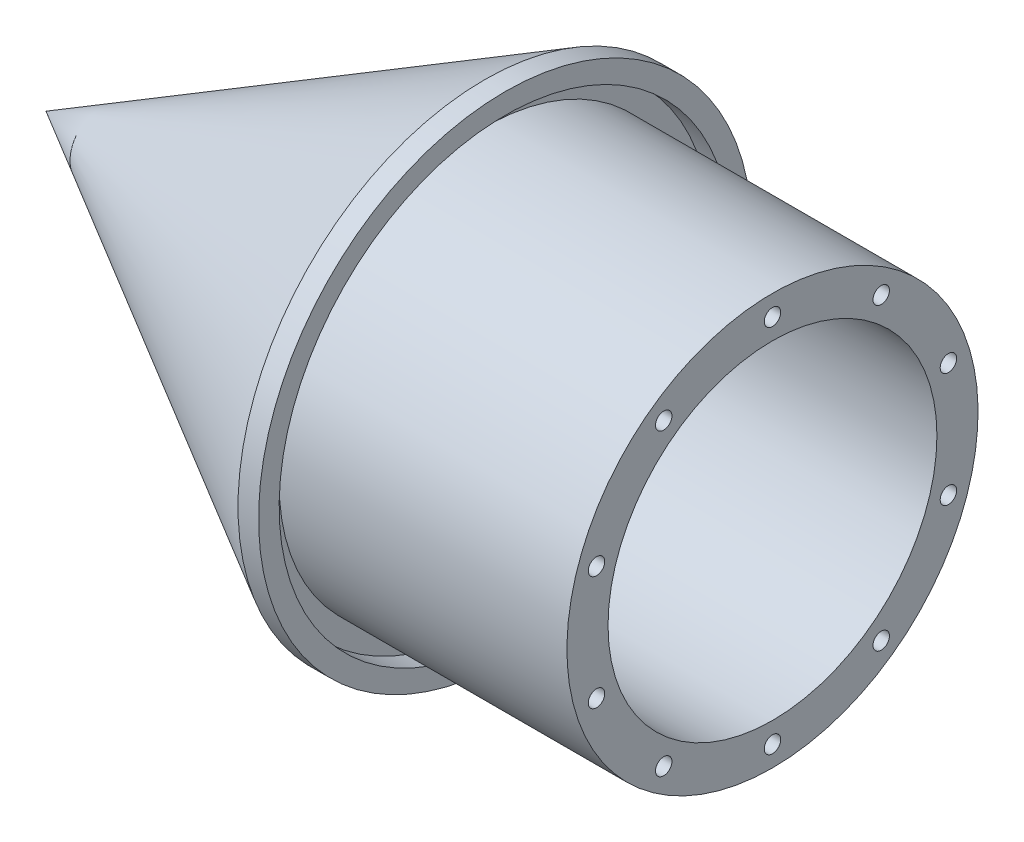
ISO-10303-21;
HEADER;
FILE_DESCRIPTION(('STEP AP214'),'2;1');
FILE_NAME('part.step','',(''),(''),'','','');
FILE_SCHEMA(('AUTOMOTIVE_DESIGN { 1 0 10303 214 1 1 1 1 }'));
ENDSEC;
DATA;
#1=APPLICATION_CONTEXT('core data for automotive mechanical design processes');
#2=APPLICATION_PROTOCOL_DEFINITION('international standard','automotive_design',2000,#1);
#3=PRODUCT_CONTEXT('',#1,'mechanical');
#4=PRODUCT('Part','Part','',(#3));
#5=PRODUCT_RELATED_PRODUCT_CATEGORY('part','',(#4));
#6=PRODUCT_DEFINITION_FORMATION('','',#4);
#7=PRODUCT_DEFINITION_CONTEXT('part definition',#1,'design');
#8=PRODUCT_DEFINITION('design','',#6,#7);
#9=PRODUCT_DEFINITION_SHAPE('','',#8);
#10=(LENGTH_UNIT() NAMED_UNIT(*) SI_UNIT(.MILLI.,.METRE.));
#11=(NAMED_UNIT(*) PLANE_ANGLE_UNIT() SI_UNIT($,.RADIAN.));
#12=(NAMED_UNIT(*) SI_UNIT($,.STERADIAN.) SOLID_ANGLE_UNIT());
#13=UNCERTAINTY_MEASURE_WITH_UNIT(LENGTH_MEASURE(1.E-05),#10,'distance_accuracy_value','');
#14=(GEOMETRIC_REPRESENTATION_CONTEXT(3) GLOBAL_UNCERTAINTY_ASSIGNED_CONTEXT((#13)) GLOBAL_UNIT_ASSIGNED_CONTEXT((#10,
#11,#12)) REPRESENTATION_CONTEXT('',''));
#15=CARTESIAN_POINT('',(0.,0.,0.));
#16=DIRECTION('',(0.,0.,1.));
#17=DIRECTION('',(1.,0.,0.));
#18=AXIS2_PLACEMENT_3D('',#15,#16,#17);
#19=CARTESIAN_POINT('',(-123.889506721427,0.,0.));
#20=DIRECTION('',(-1.,0.,0.));
#21=DIRECTION('',(0.,-1.,0.));
#22=AXIS2_PLACEMENT_3D('',#19,#20,#21);
#23=CYLINDRICAL_SURFACE('',#22,60.);
#24=CARTESIAN_POINT('',(-70.,0.,0.));
#25=DIRECTION('',(-1.,0.,0.));
#26=DIRECTION('',(0.,-1.,0.));
#27=AXIS2_PLACEMENT_3D('',#24,#25,#26);
#28=CIRCLE('',#27,60.);
#29=CARTESIAN_POINT('',(-70.,-60.,0.));
#30=VERTEX_POINT('',#29);
#31=EDGE_CURVE('E11',#30,#30,#28,.T.);
#32=ORIENTED_EDGE('',*,*,#31,.F.);
#33=EDGE_LOOP('',(#32));
#34=FACE_BOUND('',#33,.T.);
#35=CARTESIAN_POINT('',(-65.,0.,0.));
#36=DIRECTION('',(-1.,0.,0.));
#37=DIRECTION('',(0.,-1.,0.));
#38=AXIS2_PLACEMENT_3D('',#35,#36,#37);
#39=CIRCLE('',#38,60.);
#40=CARTESIAN_POINT('',(-65.,-60.,0.));
#41=VERTEX_POINT('',#40);
#42=EDGE_CURVE('E66',#41,#41,#39,.T.);
#43=ORIENTED_EDGE('',*,*,#42,.T.);
#44=EDGE_LOOP('',(#43));
#45=FACE_BOUND('',#44,.T.);
#46=ADVANCED_FACE('F43',(#34,#45),#23,.T.);
#47=CARTESIAN_POINT('',(-70.,0.,0.));
#48=DIRECTION('',(1.,0.,0.));
#49=DIRECTION('',(0.,1.,0.));
#50=AXIS2_PLACEMENT_3D('',#47,#48,#49);
#51=CONICAL_SURFACE('',#50,60.,0.512254135460329);
#52=CARTESIAN_POINT('',(-176.700455888087,0.,0.));
#53=VERTEX_POINT('',#52);
#54=VERTEX_LOOP('',#53);
#55=FACE_BOUND('',#54,.T.);
#56=ORIENTED_EDGE('',*,*,#31,.T.);
#57=EDGE_LOOP('',(#56));
#58=FACE_BOUND('',#57,.T.);
#59=ADVANCED_FACE('F56',(#55,#58),#51,.T.);
#60=CARTESIAN_POINT('',(-160.,0.,0.));
#61=DIRECTION('',(1.,0.,0.));
#62=DIRECTION('',(0.,1.,0.));
#63=AXIS2_PLACEMENT_3D('',#60,#61,#62);
#64=CONICAL_SURFACE('',#63,0.,0.512389460310737);
#65=CARTESIAN_POINT('',(-80.,0.,0.));
#66=DIRECTION('',(-1.,0.,0.));
#67=DIRECTION('',(0.,-1.,0.));
#68=AXIS2_PLACEMENT_3D('',#65,#66,#67);
#69=CIRCLE('',#68,45.);
#70=CARTESIAN_POINT('',(-80.,-45.,0.));
#71=VERTEX_POINT('',#70);
#72=EDGE_CURVE('E50',#71,#71,#69,.T.);
#73=ORIENTED_EDGE('',*,*,#72,.F.);
#74=EDGE_LOOP('',(#73));
#75=FACE_BOUND('',#74,.T.);
#76=CARTESIAN_POINT('',(-160.,0.,0.));
#77=VERTEX_POINT('',#76);
#78=VERTEX_LOOP('',#77);
#79=FACE_BOUND('',#78,.T.);
#80=ADVANCED_FACE('F59',(#75,#79),#64,.F.);
#81=CARTESIAN_POINT('',(-80.,0.,0.));
#82=DIRECTION('',(-1.,0.,0.));
#83=DIRECTION('',(0.,-1.,0.));
#84=AXIS2_PLACEMENT_3D('',#81,#82,#83);
#85=PLANE('',#84);
#86=ORIENTED_EDGE('',*,*,#72,.T.);
#87=EDGE_LOOP('',(#86));
#88=FACE_BOUND('',#87,.T.);
#89=CARTESIAN_POINT('',(-80.,0.,0.));
#90=DIRECTION('',(-1.,0.,0.));
#91=DIRECTION('',(0.,-1.,0.));
#92=AXIS2_PLACEMENT_3D('',#89,#90,#91);
#93=CIRCLE('',#92,40.);
#94=CARTESIAN_POINT('',(-80.,-40.,0.));
#95=VERTEX_POINT('',#94);
#96=EDGE_CURVE('E90',#95,#95,#93,.T.);
#97=ORIENTED_EDGE('',*,*,#96,.F.);
#98=EDGE_LOOP('',(#97));
#99=FACE_BOUND('',#98,.T.);
#100=ADVANCED_FACE('F95',(#88,#99),#85,.T.);
#101=CARTESIAN_POINT('',(-123.889506721427,0.,0.));
#102=DIRECTION('',(-1.,0.,0.));
#103=DIRECTION('',(0.,-1.,0.));
#104=AXIS2_PLACEMENT_3D('',#101,#102,#103);
#105=CYLINDRICAL_SURFACE('',#104,40.);
#106=ORIENTED_EDGE('',*,*,#96,.T.);
#107=EDGE_LOOP('',(#106));
#108=FACE_BOUND('',#107,.T.);
#109=CARTESIAN_POINT('',(0.,0.,0.));
#110=DIRECTION('',(-1.,0.,0.));
#111=DIRECTION('',(0.,-1.,0.));
#112=AXIS2_PLACEMENT_3D('',#109,#110,#111);
#113=CIRCLE('',#112,40.);
#114=CARTESIAN_POINT('',(0.,-40.,0.));
#115=VERTEX_POINT('',#114);
#116=EDGE_CURVE('E87',#115,#115,#113,.T.);
#117=ORIENTED_EDGE('',*,*,#116,.F.);
#118=EDGE_LOOP('',(#117));
#119=FACE_BOUND('',#118,.T.);
#120=ADVANCED_FACE('F103',(#108,#119),#105,.F.);
#121=CARTESIAN_POINT('',(0.,0.,0.));
#122=DIRECTION('',(-1.,0.,0.));
#123=DIRECTION('',(0.,-1.,0.));
#124=AXIS2_PLACEMENT_3D('',#121,#122,#123);
#125=PLANE('',#124);
#126=CARTESIAN_POINT('',(0.,36.405764746873,26.4503363531608));
#127=DIRECTION('',(1.,0.,0.));
#128=DIRECTION('',(0.,0.809016994374955,0.587785252292462));
#129=AXIS2_PLACEMENT_3D('',#126,#127,#128);
#130=CIRCLE('',#129,2.);
#131=CARTESIAN_POINT('',(0.,38.0237987356229,27.6259068577457));
#132=VERTEX_POINT('',#131);
#133=EDGE_CURVE('E260',#132,#132,#130,.T.);
#134=ORIENTED_EDGE('',*,*,#133,.F.);
#135=EDGE_LOOP('',(#134));
#136=FACE_BOUND('',#135,.T.);
#137=CARTESIAN_POINT('',(0.,13.9057647468731,42.7975432332817));
#138=DIRECTION('',(1.,0.,0.));
#139=DIRECTION('',(0.,0.309016994374958,0.95105651629515));
#140=AXIS2_PLACEMENT_3D('',#137,#138,#139);
#141=CIRCLE('',#140,2.);
#142=CARTESIAN_POINT('',(0.,14.523798735623,44.699656265872));
#143=VERTEX_POINT('',#142);
#144=EDGE_CURVE('E254',#143,#143,#141,.T.);
#145=ORIENTED_EDGE('',*,*,#144,.F.);
#146=EDGE_LOOP('',(#145));
#147=FACE_BOUND('',#146,.T.);
#148=CARTESIAN_POINT('',(0.,-13.9057647468722,42.797543233282));
#149=DIRECTION('',(1.,0.,0.));
#150=DIRECTION('',(0.,-0.309016994374938,0.951056516295157));
#151=AXIS2_PLACEMENT_3D('',#148,#149,#150);
#152=CIRCLE('',#151,2.);
#153=CARTESIAN_POINT('',(0.,-14.5237987356221,44.6996562658723));
#154=VERTEX_POINT('',#153);
#155=EDGE_CURVE('E248',#154,#154,#152,.T.);
#156=ORIENTED_EDGE('',*,*,#155,.F.);
#157=EDGE_LOOP('',(#156));
#158=FACE_BOUND('',#157,.T.);
#159=CARTESIAN_POINT('',(0.,-36.4057647468724,26.4503363531616));
#160=DIRECTION('',(1.,0.,0.));
#161=DIRECTION('',(0.,-0.809016994374942,0.58778525229248));
#162=AXIS2_PLACEMENT_3D('',#159,#160,#161);
#163=CIRCLE('',#162,2.);
#164=CARTESIAN_POINT('',(0.,-38.0237987356223,27.6259068577466));
#165=VERTEX_POINT('',#164);
#166=EDGE_CURVE('E242',#165,#165,#163,.T.);
#167=ORIENTED_EDGE('',*,*,#166,.F.);
#168=EDGE_LOOP('',(#167));
#169=FACE_BOUND('',#168,.T.);
#170=CARTESIAN_POINT('',(0.,-45.,0.));
#171=DIRECTION('',(1.,0.,0.));
#172=DIRECTION('',(0.,-1.,0.));
#173=AXIS2_PLACEMENT_3D('',#170,#171,#172);
#174=CIRCLE('',#173,2.);
#175=CARTESIAN_POINT('',(0.,-47.,0.));
#176=VERTEX_POINT('',#175);
#177=EDGE_CURVE('E236',#176,#176,#174,.T.);
#178=ORIENTED_EDGE('',*,*,#177,.F.);
#179=EDGE_LOOP('',(#178));
#180=FACE_BOUND('',#179,.T.);
#181=CARTESIAN_POINT('',(0.,-36.4057647468728,-26.4503363531611));
#182=DIRECTION('',(1.,0.,0.));
#183=DIRECTION('',(0.,-0.809016994374951,-0.587785252292469));
#184=AXIS2_PLACEMENT_3D('',#181,#182,#183);
#185=CIRCLE('',#184,2.);
#186=CARTESIAN_POINT('',(0.,-38.0237987356227,-27.625906857746));
#187=VERTEX_POINT('',#186);
#188=EDGE_CURVE('E230',#187,#187,#185,.T.);
#189=ORIENTED_EDGE('',*,*,#188,.F.);
#190=EDGE_LOOP('',(#189));
#191=FACE_BOUND('',#190,.T.);
#192=CARTESIAN_POINT('',(0.,-13.9057647468728,-42.7975432332818));
#193=DIRECTION('',(1.,0.,0.));
#194=DIRECTION('',(0.,-0.309016994374952,-0.951056516295152));
#195=AXIS2_PLACEMENT_3D('',#192,#193,#194);
#196=CIRCLE('',#195,2.);
#197=CARTESIAN_POINT('',(0.,-14.5237987356227,-44.6996562658721));
#198=VERTEX_POINT('',#197);
#199=EDGE_CURVE('E224',#198,#198,#196,.T.);
#200=ORIENTED_EDGE('',*,*,#199,.F.);
#201=EDGE_LOOP('',(#200));
#202=FACE_BOUND('',#201,.T.);
#203=CARTESIAN_POINT('',(0.,13.9057647468725,-42.7975432332819));
#204=DIRECTION('',(1.,0.,0.));
#205=DIRECTION('',(0.,0.309016994374945,-0.951056516295155));
#206=AXIS2_PLACEMENT_3D('',#203,#204,#205);
#207=CIRCLE('',#206,2.);
#208=CARTESIAN_POINT('',(0.,14.5237987356224,-44.6996562658722));
#209=VERTEX_POINT('',#208);
#210=EDGE_CURVE('E213',#209,#209,#207,.T.);
#211=ORIENTED_EDGE('',*,*,#210,.F.);
#212=EDGE_LOOP('',(#211));
#213=FACE_BOUND('',#212,.T.);
#214=CARTESIAN_POINT('',(0.,36.4057647468726,-26.4503363531613));
#215=DIRECTION('',(1.,0.,0.));
#216=DIRECTION('',(0.,0.809016994374947,-0.587785252292474));
#217=AXIS2_PLACEMENT_3D('',#214,#215,#216);
#218=CIRCLE('',#217,2.);
#219=CARTESIAN_POINT('',(0.,38.0237987356225,-27.6259068577463));
#220=VERTEX_POINT('',#219);
#221=EDGE_CURVE('E212',#220,#220,#218,.T.);
#222=ORIENTED_EDGE('',*,*,#221,.F.);
#223=EDGE_LOOP('',(#222));
#224=FACE_BOUND('',#223,.T.);
#225=CARTESIAN_POINT('',(0.,45.,0.));
#226=DIRECTION('',(1.,0.,0.));
#227=DIRECTION('',(0.,1.,0.));
#228=AXIS2_PLACEMENT_3D('',#225,#226,#227);
#229=CIRCLE('',#228,2.);
#230=CARTESIAN_POINT('',(0.,47.,0.));
#231=VERTEX_POINT('',#230);
#232=EDGE_CURVE('E75',#231,#231,#229,.T.);
#233=ORIENTED_EDGE('',*,*,#232,.F.);
#234=EDGE_LOOP('',(#233));
#235=FACE_BOUND('',#234,.T.);
#236=CARTESIAN_POINT('',(0.,0.,0.));
#237=DIRECTION('',(-1.,0.,0.));
#238=DIRECTION('',(0.,-1.,0.));
#239=AXIS2_PLACEMENT_3D('',#236,#237,#238);
#240=CIRCLE('',#239,50.);
#241=CARTESIAN_POINT('',(0.,-50.,0.));
#242=VERTEX_POINT('',#241);
#243=EDGE_CURVE('E84',#242,#242,#240,.T.);
#244=ORIENTED_EDGE('',*,*,#243,.F.);
#245=EDGE_LOOP('',(#244));
#246=FACE_BOUND('',#245,.T.);
#247=ORIENTED_EDGE('',*,*,#116,.T.);
#248=EDGE_LOOP('',(#247));
#249=FACE_BOUND('',#248,.T.);
#250=ADVANCED_FACE('F108',(#136,#147,#158,#169,#180,#191,#202,#213,#224,#235,#246,#249),#125,.F.);
#251=CARTESIAN_POINT('',(-123.889506721427,0.,0.));
#252=DIRECTION('',(-1.,0.,0.));
#253=DIRECTION('',(0.,-1.,0.));
#254=AXIS2_PLACEMENT_3D('',#251,#252,#253);
#255=CYLINDRICAL_SURFACE('',#254,50.);
#256=CARTESIAN_POINT('',(-70.,0.,0.));
#257=DIRECTION('',(-1.,0.,0.));
#258=DIRECTION('',(0.,-1.,0.));
#259=AXIS2_PLACEMENT_3D('',#256,#257,#258);
#260=CIRCLE('',#259,50.);
#261=CARTESIAN_POINT('',(-70.,-50.,0.));
#262=VERTEX_POINT('',#261);
#263=EDGE_CURVE('E81',#262,#262,#260,.T.);
#264=ORIENTED_EDGE('',*,*,#263,.F.);
#265=EDGE_LOOP('',(#264));
#266=FACE_BOUND('',#265,.T.);
#267=ORIENTED_EDGE('',*,*,#243,.T.);
#268=EDGE_LOOP('',(#267));
#269=FACE_BOUND('',#268,.T.);
#270=ADVANCED_FACE('F112',(#266,#269),#255,.T.);
#271=CARTESIAN_POINT('',(-70.,0.,0.));
#272=DIRECTION('',(-1.,0.,0.));
#273=DIRECTION('',(0.,-1.,0.));
#274=AXIS2_PLACEMENT_3D('',#271,#272,#273);
#275=PLANE('',#274);
#276=CARTESIAN_POINT('',(-70.,0.,0.));
#277=DIRECTION('',(-1.,0.,0.));
#278=DIRECTION('',(0.,-1.,0.));
#279=AXIS2_PLACEMENT_3D('',#276,#277,#278);
#280=CIRCLE('',#279,55.);
#281=CARTESIAN_POINT('',(-70.,-55.,0.));
#282=VERTEX_POINT('',#281);
#283=EDGE_CURVE('E72',#282,#282,#280,.T.);
#284=ORIENTED_EDGE('',*,*,#283,.F.);
#285=EDGE_LOOP('',(#284));
#286=FACE_BOUND('',#285,.T.);
#287=ORIENTED_EDGE('',*,*,#263,.T.);
#288=EDGE_LOOP('',(#287));
#289=FACE_BOUND('',#288,.T.);
#290=ADVANCED_FACE('F116',(#286,#289),#275,.F.);
#291=CARTESIAN_POINT('',(-123.889506721427,0.,0.));
#292=DIRECTION('',(-1.,0.,0.));
#293=DIRECTION('',(0.,-1.,0.));
#294=AXIS2_PLACEMENT_3D('',#291,#292,#293);
#295=CYLINDRICAL_SURFACE('',#294,55.);
#296=CARTESIAN_POINT('',(-65.,0.,0.));
#297=DIRECTION('',(-1.,0.,0.));
#298=DIRECTION('',(0.,-1.,0.));
#299=AXIS2_PLACEMENT_3D('',#296,#297,#298);
#300=CIRCLE('',#299,55.);
#301=CARTESIAN_POINT('',(-65.,-55.,0.));
#302=VERTEX_POINT('',#301);
#303=EDGE_CURVE('E68',#302,#302,#300,.T.);
#304=ORIENTED_EDGE('',*,*,#303,.F.);
#305=EDGE_LOOP('',(#304));
#306=FACE_BOUND('',#305,.T.);
#307=ORIENTED_EDGE('',*,*,#283,.T.);
#308=EDGE_LOOP('',(#307));
#309=FACE_BOUND('',#308,.T.);
#310=ADVANCED_FACE('F120',(#306,#309),#295,.F.);
#311=CARTESIAN_POINT('',(-65.,0.,0.));
#312=DIRECTION('',(-1.,0.,0.));
#313=DIRECTION('',(0.,-1.,0.));
#314=AXIS2_PLACEMENT_3D('',#311,#312,#313);
#315=PLANE('',#314);
#316=ORIENTED_EDGE('',*,*,#42,.F.);
#317=EDGE_LOOP('',(#316));
#318=FACE_BOUND('',#317,.T.);
#319=ORIENTED_EDGE('',*,*,#303,.T.);
#320=EDGE_LOOP('',(#319));
#321=FACE_BOUND('',#320,.T.);
#322=ADVANCED_FACE('F124',(#318,#321),#315,.F.);
#323=CARTESIAN_POINT('',(-20.,45.,0.));
#324=DIRECTION('',(1.,0.,0.));
#325=DIRECTION('',(0.,1.,0.));
#326=AXIS2_PLACEMENT_3D('',#323,#324,#325);
#327=CYLINDRICAL_SURFACE('',#326,2.);
#328=CARTESIAN_POINT('',(-20.,45.,0.));
#329=DIRECTION('',(1.,0.,0.));
#330=DIRECTION('',(0.,1.,0.));
#331=AXIS2_PLACEMENT_3D('',#328,#329,#330);
#332=CIRCLE('',#331,2.);
#333=CARTESIAN_POINT('',(-20.,47.,0.));
#334=VERTEX_POINT('',#333);
#335=EDGE_CURVE('E69',#334,#334,#332,.T.);
#336=ORIENTED_EDGE('',*,*,#335,.F.);
#337=EDGE_LOOP('',(#336));
#338=FACE_BOUND('',#337,.T.);
#339=ORIENTED_EDGE('',*,*,#232,.T.);
#340=EDGE_LOOP('',(#339));
#341=FACE_BOUND('',#340,.T.);
#342=ADVANCED_FACE('F128',(#338,#341),#327,.F.);
#343=CARTESIAN_POINT('',(-20.,45.,0.));
#344=DIRECTION('',(1.,0.,0.));
#345=DIRECTION('',(0.,1.,0.));
#346=AXIS2_PLACEMENT_3D('',#343,#344,#345);
#347=PLANE('',#346);
#348=ORIENTED_EDGE('',*,*,#335,.T.);
#349=EDGE_LOOP('',(#348));
#350=FACE_BOUND('',#349,.T.);
#351=ADVANCED_FACE('F131',(#350),#347,.T.);
#352=CARTESIAN_POINT('',(-20.,36.4057647468726,-26.4503363531613));
#353=DIRECTION('',(1.,0.,0.));
#354=DIRECTION('',(0.,1.,0.));
#355=AXIS2_PLACEMENT_3D('',#352,#353,#354);
#356=CYLINDRICAL_SURFACE('',#355,2.);
#357=CARTESIAN_POINT('',(-20.,36.4057647468726,-26.4503363531613));
#358=DIRECTION('',(1.,0.,0.));
#359=DIRECTION('',(0.,0.809016994374947,-0.587785252292474));
#360=AXIS2_PLACEMENT_3D('',#357,#358,#359);
#361=CIRCLE('',#360,2.);
#362=CARTESIAN_POINT('',(-20.,38.0237987356225,-27.6259068577463));
#363=VERTEX_POINT('',#362);
#364=EDGE_CURVE('E216',#363,#363,#361,.T.);
#365=ORIENTED_EDGE('',*,*,#364,.F.);
#366=EDGE_LOOP('',(#365));
#367=FACE_BOUND('',#366,.T.);
#368=ORIENTED_EDGE('',*,*,#221,.T.);
#369=EDGE_LOOP('',(#368));
#370=FACE_BOUND('',#369,.T.);
#371=ADVANCED_FACE('F135',(#367,#370),#356,.F.);
#372=CARTESIAN_POINT('',(-20.,36.4057647468726,-26.4503363531613));
#373=DIRECTION('',(1.,0.,0.));
#374=DIRECTION('',(0.,0.809016994374947,-0.587785252292474));
#375=AXIS2_PLACEMENT_3D('',#372,#373,#374);
#376=PLANE('',#375);
#377=ORIENTED_EDGE('',*,*,#364,.T.);
#378=EDGE_LOOP('',(#377));
#379=FACE_BOUND('',#378,.T.);
#380=ADVANCED_FACE('F139',(#379),#376,.T.);
#381=CARTESIAN_POINT('',(-20.,13.9057647468725,-42.7975432332819));
#382=DIRECTION('',(1.,0.,0.));
#383=DIRECTION('',(0.,1.,0.));
#384=AXIS2_PLACEMENT_3D('',#381,#382,#383);
#385=CYLINDRICAL_SURFACE('',#384,2.);
#386=CARTESIAN_POINT('',(-20.,13.9057647468725,-42.7975432332819));
#387=DIRECTION('',(1.,0.,0.));
#388=DIRECTION('',(0.,0.309016994374945,-0.951056516295155));
#389=AXIS2_PLACEMENT_3D('',#386,#387,#388);
#390=CIRCLE('',#389,2.);
#391=CARTESIAN_POINT('',(-20.,14.5237987356224,-44.6996562658722));
#392=VERTEX_POINT('',#391);
#393=EDGE_CURVE('E211',#392,#392,#390,.T.);
#394=ORIENTED_EDGE('',*,*,#393,.F.);
#395=EDGE_LOOP('',(#394));
#396=FACE_BOUND('',#395,.T.);
#397=ORIENTED_EDGE('',*,*,#210,.T.);
#398=EDGE_LOOP('',(#397));
#399=FACE_BOUND('',#398,.T.);
#400=ADVANCED_FACE('F143',(#396,#399),#385,.F.);
#401=CARTESIAN_POINT('',(-20.,13.9057647468725,-42.7975432332819));
#402=DIRECTION('',(1.,0.,0.));
#403=DIRECTION('',(0.,0.309016994374945,-0.951056516295155));
#404=AXIS2_PLACEMENT_3D('',#401,#402,#403);
#405=PLANE('',#404);
#406=ORIENTED_EDGE('',*,*,#393,.T.);
#407=EDGE_LOOP('',(#406));
#408=FACE_BOUND('',#407,.T.);
#409=ADVANCED_FACE('F197',(#408),#405,.T.);
#410=CARTESIAN_POINT('',(-20.,-13.9057647468728,-42.7975432332818));
#411=DIRECTION('',(1.,0.,0.));
#412=DIRECTION('',(0.,1.,0.));
#413=AXIS2_PLACEMENT_3D('',#410,#411,#412);
#414=CYLINDRICAL_SURFACE('',#413,2.);
#415=CARTESIAN_POINT('',(-20.,-13.9057647468728,-42.7975432332818));
#416=DIRECTION('',(1.,0.,0.));
#417=DIRECTION('',(0.,-0.309016994374952,-0.951056516295152));
#418=AXIS2_PLACEMENT_3D('',#415,#416,#417);
#419=CIRCLE('',#418,2.);
#420=CARTESIAN_POINT('',(-20.,-14.5237987356227,-44.6996562658721));
#421=VERTEX_POINT('',#420);
#422=EDGE_CURVE('E219',#421,#421,#419,.T.);
#423=ORIENTED_EDGE('',*,*,#422,.F.);
#424=EDGE_LOOP('',(#423));
#425=FACE_BOUND('',#424,.T.);
#426=ORIENTED_EDGE('',*,*,#199,.T.);
#427=EDGE_LOOP('',(#426));
#428=FACE_BOUND('',#427,.T.);
#429=ADVANCED_FACE('F194',(#425,#428),#414,.F.);
#430=CARTESIAN_POINT('',(-20.,-13.9057647468728,-42.7975432332818));
#431=DIRECTION('',(1.,0.,0.));
#432=DIRECTION('',(0.,-0.309016994374952,-0.951056516295152));
#433=AXIS2_PLACEMENT_3D('',#430,#431,#432);
#434=PLANE('',#433);
#435=ORIENTED_EDGE('',*,*,#422,.T.);
#436=EDGE_LOOP('',(#435));
#437=FACE_BOUND('',#436,.T.);
#438=ADVANCED_FACE('F189',(#437),#434,.T.);
#439=CARTESIAN_POINT('',(-20.,-36.4057647468728,-26.4503363531611));
#440=DIRECTION('',(1.,0.,0.));
#441=DIRECTION('',(0.,1.,0.));
#442=AXIS2_PLACEMENT_3D('',#439,#440,#441);
#443=CYLINDRICAL_SURFACE('',#442,2.);
#444=CARTESIAN_POINT('',(-20.,-36.4057647468728,-26.4503363531611));
#445=DIRECTION('',(1.,0.,0.));
#446=DIRECTION('',(0.,-0.809016994374951,-0.587785252292469));
#447=AXIS2_PLACEMENT_3D('',#444,#445,#446);
#448=CIRCLE('',#447,2.);
#449=CARTESIAN_POINT('',(-20.,-38.0237987356227,-27.625906857746));
#450=VERTEX_POINT('',#449);
#451=EDGE_CURVE('E227',#450,#450,#448,.T.);
#452=ORIENTED_EDGE('',*,*,#451,.F.);
#453=EDGE_LOOP('',(#452));
#454=FACE_BOUND('',#453,.T.);
#455=ORIENTED_EDGE('',*,*,#188,.T.);
#456=EDGE_LOOP('',(#455));
#457=FACE_BOUND('',#456,.T.);
#458=ADVANCED_FACE('F186',(#454,#457),#443,.F.);
#459=CARTESIAN_POINT('',(-20.,-36.4057647468728,-26.4503363531611));
#460=DIRECTION('',(1.,0.,0.));
#461=DIRECTION('',(0.,-0.809016994374951,-0.587785252292469));
#462=AXIS2_PLACEMENT_3D('',#459,#460,#461);
#463=PLANE('',#462);
#464=ORIENTED_EDGE('',*,*,#451,.T.);
#465=EDGE_LOOP('',(#464));
#466=FACE_BOUND('',#465,.T.);
#467=ADVANCED_FACE('F181',(#466),#463,.T.);
#468=CARTESIAN_POINT('',(-20.,-45.,0.));
#469=DIRECTION('',(1.,0.,0.));
#470=DIRECTION('',(0.,1.,0.));
#471=AXIS2_PLACEMENT_3D('',#468,#469,#470);
#472=CYLINDRICAL_SURFACE('',#471,2.);
#473=CARTESIAN_POINT('',(-20.,-45.,0.));
#474=DIRECTION('',(1.,0.,0.));
#475=DIRECTION('',(0.,-1.,0.));
#476=AXIS2_PLACEMENT_3D('',#473,#474,#475);
#477=CIRCLE('',#476,2.);
#478=CARTESIAN_POINT('',(-20.,-47.,0.));
#479=VERTEX_POINT('',#478);
#480=EDGE_CURVE('E233',#479,#479,#477,.T.);
#481=ORIENTED_EDGE('',*,*,#480,.F.);
#482=EDGE_LOOP('',(#481));
#483=FACE_BOUND('',#482,.T.);
#484=ORIENTED_EDGE('',*,*,#177,.T.);
#485=EDGE_LOOP('',(#484));
#486=FACE_BOUND('',#485,.T.);
#487=ADVANCED_FACE('F178',(#483,#486),#472,.F.);
#488=CARTESIAN_POINT('',(-20.,-45.,0.));
#489=DIRECTION('',(1.,0.,0.));
#490=DIRECTION('',(0.,-1.,0.));
#491=AXIS2_PLACEMENT_3D('',#488,#489,#490);
#492=PLANE('',#491);
#493=ORIENTED_EDGE('',*,*,#480,.T.);
#494=EDGE_LOOP('',(#493));
#495=FACE_BOUND('',#494,.T.);
#496=ADVANCED_FACE('F173',(#495),#492,.T.);
#497=CARTESIAN_POINT('',(-20.,-36.4057647468724,26.4503363531616));
#498=DIRECTION('',(1.,0.,0.));
#499=DIRECTION('',(0.,1.,0.));
#500=AXIS2_PLACEMENT_3D('',#497,#498,#499);
#501=CYLINDRICAL_SURFACE('',#500,2.);
#502=CARTESIAN_POINT('',(-20.,-36.4057647468724,26.4503363531616));
#503=DIRECTION('',(1.,0.,0.));
#504=DIRECTION('',(0.,-0.809016994374942,0.58778525229248));
#505=AXIS2_PLACEMENT_3D('',#502,#503,#504);
#506=CIRCLE('',#505,2.);
#507=CARTESIAN_POINT('',(-20.,-38.0237987356223,27.6259068577466));
#508=VERTEX_POINT('',#507);
#509=EDGE_CURVE('E239',#508,#508,#506,.T.);
#510=ORIENTED_EDGE('',*,*,#509,.F.);
#511=EDGE_LOOP('',(#510));
#512=FACE_BOUND('',#511,.T.);
#513=ORIENTED_EDGE('',*,*,#166,.T.);
#514=EDGE_LOOP('',(#513));
#515=FACE_BOUND('',#514,.T.);
#516=ADVANCED_FACE('F170',(#512,#515),#501,.F.);
#517=CARTESIAN_POINT('',(-20.,-36.4057647468724,26.4503363531616));
#518=DIRECTION('',(1.,0.,0.));
#519=DIRECTION('',(0.,-0.809016994374942,0.58778525229248));
#520=AXIS2_PLACEMENT_3D('',#517,#518,#519);
#521=PLANE('',#520);
#522=ORIENTED_EDGE('',*,*,#509,.T.);
#523=EDGE_LOOP('',(#522));
#524=FACE_BOUND('',#523,.T.);
#525=ADVANCED_FACE('F165',(#524),#521,.T.);
#526=CARTESIAN_POINT('',(-20.,-13.9057647468722,42.797543233282));
#527=DIRECTION('',(1.,0.,0.));
#528=DIRECTION('',(0.,1.,0.));
#529=AXIS2_PLACEMENT_3D('',#526,#527,#528);
#530=CYLINDRICAL_SURFACE('',#529,2.);
#531=CARTESIAN_POINT('',(-20.,-13.9057647468722,42.797543233282));
#532=DIRECTION('',(1.,0.,0.));
#533=DIRECTION('',(0.,-0.309016994374938,0.951056516295157));
#534=AXIS2_PLACEMENT_3D('',#531,#532,#533);
#535=CIRCLE('',#534,2.);
#536=CARTESIAN_POINT('',(-20.,-14.5237987356221,44.6996562658723));
#537=VERTEX_POINT('',#536);
#538=EDGE_CURVE('E245',#537,#537,#535,.T.);
#539=ORIENTED_EDGE('',*,*,#538,.F.);
#540=EDGE_LOOP('',(#539));
#541=FACE_BOUND('',#540,.T.);
#542=ORIENTED_EDGE('',*,*,#155,.T.);
#543=EDGE_LOOP('',(#542));
#544=FACE_BOUND('',#543,.T.);
#545=ADVANCED_FACE('F162',(#541,#544),#530,.F.);
#546=CARTESIAN_POINT('',(-20.,-13.9057647468722,42.797543233282));
#547=DIRECTION('',(1.,0.,0.));
#548=DIRECTION('',(0.,-0.309016994374938,0.951056516295157));
#549=AXIS2_PLACEMENT_3D('',#546,#547,#548);
#550=PLANE('',#549);
#551=ORIENTED_EDGE('',*,*,#538,.T.);
#552=EDGE_LOOP('',(#551));
#553=FACE_BOUND('',#552,.T.);
#554=ADVANCED_FACE('F157',(#553),#550,.T.);
#555=CARTESIAN_POINT('',(-20.,13.9057647468731,42.7975432332817));
#556=DIRECTION('',(1.,0.,0.));
#557=DIRECTION('',(0.,1.,0.));
#558=AXIS2_PLACEMENT_3D('',#555,#556,#557);
#559=CYLINDRICAL_SURFACE('',#558,2.);
#560=CARTESIAN_POINT('',(-20.,13.9057647468731,42.7975432332817));
#561=DIRECTION('',(1.,0.,0.));
#562=DIRECTION('',(0.,0.309016994374958,0.95105651629515));
#563=AXIS2_PLACEMENT_3D('',#560,#561,#562);
#564=CIRCLE('',#563,2.);
#565=CARTESIAN_POINT('',(-20.,14.523798735623,44.699656265872));
#566=VERTEX_POINT('',#565);
#567=EDGE_CURVE('E251',#566,#566,#564,.T.);
#568=ORIENTED_EDGE('',*,*,#567,.F.);
#569=EDGE_LOOP('',(#568));
#570=FACE_BOUND('',#569,.T.);
#571=ORIENTED_EDGE('',*,*,#144,.T.);
#572=EDGE_LOOP('',(#571));
#573=FACE_BOUND('',#572,.T.);
#574=ADVANCED_FACE('F154',(#570,#573),#559,.F.);
#575=CARTESIAN_POINT('',(-20.,13.9057647468731,42.7975432332817));
#576=DIRECTION('',(1.,0.,0.));
#577=DIRECTION('',(0.,0.309016994374958,0.95105651629515));
#578=AXIS2_PLACEMENT_3D('',#575,#576,#577);
#579=PLANE('',#578);
#580=ORIENTED_EDGE('',*,*,#567,.T.);
#581=EDGE_LOOP('',(#580));
#582=FACE_BOUND('',#581,.T.);
#583=ADVANCED_FACE('F149',(#582),#579,.T.);
#584=CARTESIAN_POINT('',(-20.,36.405764746873,26.4503363531608));
#585=DIRECTION('',(1.,0.,0.));
#586=DIRECTION('',(0.,1.,0.));
#587=AXIS2_PLACEMENT_3D('',#584,#585,#586);
#588=CYLINDRICAL_SURFACE('',#587,2.);
#589=CARTESIAN_POINT('',(-20.,36.405764746873,26.4503363531608));
#590=DIRECTION('',(1.,0.,0.));
#591=DIRECTION('',(0.,0.809016994374955,0.587785252292462));
#592=AXIS2_PLACEMENT_3D('',#589,#590,#591);
#593=CIRCLE('',#592,2.);
#594=CARTESIAN_POINT('',(-20.,38.0237987356229,27.6259068577457));
#595=VERTEX_POINT('',#594);
#596=EDGE_CURVE('E257',#595,#595,#593,.T.);
#597=ORIENTED_EDGE('',*,*,#596,.F.);
#598=EDGE_LOOP('',(#597));
#599=FACE_BOUND('',#598,.T.);
#600=ORIENTED_EDGE('',*,*,#133,.T.);
#601=EDGE_LOOP('',(#600));
#602=FACE_BOUND('',#601,.T.);
#603=ADVANCED_FACE('F145',(#599,#602),#588,.F.);
#604=CARTESIAN_POINT('',(-20.,36.405764746873,26.4503363531608));
#605=DIRECTION('',(1.,0.,0.));
#606=DIRECTION('',(0.,0.809016994374955,0.587785252292462));
#607=AXIS2_PLACEMENT_3D('',#604,#605,#606);
#608=PLANE('',#607);
#609=ORIENTED_EDGE('',*,*,#596,.T.);
#610=EDGE_LOOP('',(#609));
#611=FACE_BOUND('',#610,.T.);
#612=ADVANCED_FACE('F148',(#611),#608,.T.);
#613=CLOSED_SHELL('',(#46,#59,#80,#100,#120,#250,#270,#290,#310,#322,#342,#351,#371,#380,#400,
#409,#429,#438,#458,#467,#487,#496,#516,#525,#545,#554,#574,#583,#603,#612));
#614=MANIFOLD_SOLID_BREP('B2',#613);
#615=ADVANCED_BREP_SHAPE_REPRESENTATION('',(#18,#614),#14);
#616=SHAPE_DEFINITION_REPRESENTATION(#9,#615);
ENDSEC;
END-ISO-10303-21;
